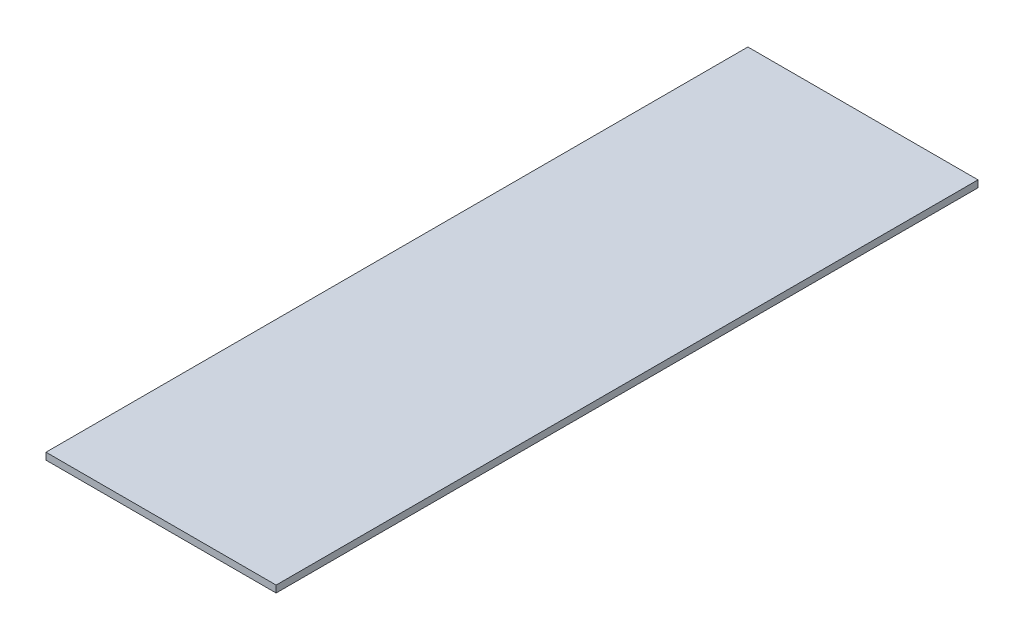
ISO-10303-21;
HEADER;
FILE_DESCRIPTION(('STEP AP214'),'2;1');
FILE_NAME('part.step','',(''),(''),'','','');
FILE_SCHEMA(('AUTOMOTIVE_DESIGN { 1 0 10303 214 1 1 1 1 }'));
ENDSEC;
DATA;
#1=APPLICATION_CONTEXT('core data for automotive mechanical design processes');
#2=APPLICATION_PROTOCOL_DEFINITION('international standard','automotive_design',2000,#1);
#3=PRODUCT_CONTEXT('',#1,'mechanical');
#4=PRODUCT('Part','Part','',(#3));
#5=PRODUCT_RELATED_PRODUCT_CATEGORY('part','',(#4));
#6=PRODUCT_DEFINITION_FORMATION('','',#4);
#7=PRODUCT_DEFINITION_CONTEXT('part definition',#1,'design');
#8=PRODUCT_DEFINITION('design','',#6,#7);
#9=PRODUCT_DEFINITION_SHAPE('','',#8);
#10=(LENGTH_UNIT() NAMED_UNIT(*) SI_UNIT(.MILLI.,.METRE.));
#11=(NAMED_UNIT(*) PLANE_ANGLE_UNIT() SI_UNIT($,.RADIAN.));
#12=(NAMED_UNIT(*) SI_UNIT($,.STERADIAN.) SOLID_ANGLE_UNIT());
#13=UNCERTAINTY_MEASURE_WITH_UNIT(LENGTH_MEASURE(1.E-05),#10,'distance_accuracy_value','');
#14=(GEOMETRIC_REPRESENTATION_CONTEXT(3) GLOBAL_UNCERTAINTY_ASSIGNED_CONTEXT((#13)) GLOBAL_UNIT_ASSIGNED_CONTEXT((#10,
#11,#12)) REPRESENTATION_CONTEXT('',''));
#15=CARTESIAN_POINT('',(0.,0.,0.));
#16=DIRECTION('',(0.,0.,1.));
#17=DIRECTION('',(1.,0.,0.));
#18=AXIS2_PLACEMENT_3D('',#15,#16,#17);
#19=CARTESIAN_POINT('',(50.,3.,-155.));
#20=DIRECTION('',(-1.,0.,0.));
#21=DIRECTION('',(0.,0.,1.));
#22=AXIS2_PLACEMENT_3D('',#19,#20,#21);
#23=PLANE('',#22);
#24=DIRECTION('',(0.,0.,-1.));
#25=VECTOR('',#24,1.);
#26=CARTESIAN_POINT('',(50.,0.,-155.));
#27=LINE('',#26,#25);
#28=CARTESIAN_POINT('',(50.,0.,152.5));
#29=VERTEX_POINT('',#28);
#30=CARTESIAN_POINT('',(50.,0.,-152.5));
#31=VERTEX_POINT('',#30);
#32=EDGE_CURVE('E101',#29,#31,#27,.T.);
#33=ORIENTED_EDGE('',*,*,#32,.T.);
#34=DIRECTION('',(0.,1.,0.));
#35=VECTOR('',#34,1.);
#36=CARTESIAN_POINT('',(50.,-7.,-152.5));
#37=LINE('',#36,#35);
#38=CARTESIAN_POINT('',(50.,3.,-152.5));
#39=VERTEX_POINT('',#38);
#40=EDGE_CURVE('E61',#31,#39,#37,.T.);
#41=ORIENTED_EDGE('',*,*,#40,.T.);
#42=DIRECTION('',(0.,0.,-1.));
#43=VECTOR('',#42,1.);
#44=CARTESIAN_POINT('',(50.,3.,-155.));
#45=LINE('',#44,#43);
#46=CARTESIAN_POINT('',(50.,3.,152.5));
#47=VERTEX_POINT('',#46);
#48=EDGE_CURVE('E92',#47,#39,#45,.T.);
#49=ORIENTED_EDGE('',*,*,#48,.F.);
#50=DIRECTION('',(0.,1.,0.));
#51=VECTOR('',#50,1.);
#52=CARTESIAN_POINT('',(50.,-7.,152.5));
#53=LINE('',#52,#51);
#54=EDGE_CURVE('E109',#29,#47,#53,.T.);
#55=ORIENTED_EDGE('',*,*,#54,.F.);
#56=EDGE_LOOP('',(#33,#41,#49,#55));
#57=FACE_BOUND('',#56,.T.);
#58=ADVANCED_FACE('F39',(#57),#23,.F.);
#59=CARTESIAN_POINT('',(-50.,3.,-155.));
#60=DIRECTION('',(1.,0.,0.));
#61=DIRECTION('',(0.,0.,-1.));
#62=AXIS2_PLACEMENT_3D('',#59,#60,#61);
#63=PLANE('',#62);
#64=DIRECTION('',(0.,0.,1.));
#65=VECTOR('',#64,1.);
#66=CARTESIAN_POINT('',(-50.,3.,-155.));
#67=LINE('',#66,#65);
#68=CARTESIAN_POINT('',(-50.,3.,-152.5));
#69=VERTEX_POINT('',#68);
#70=CARTESIAN_POINT('',(-50.,3.,152.5));
#71=VERTEX_POINT('',#70);
#72=EDGE_CURVE('E90',#69,#71,#67,.T.);
#73=ORIENTED_EDGE('',*,*,#72,.F.);
#74=DIRECTION('',(0.,1.,0.));
#75=VECTOR('',#74,1.);
#76=CARTESIAN_POINT('',(-50.,-7.,-152.5));
#77=LINE('',#76,#75);
#78=CARTESIAN_POINT('',(-50.,0.,-152.5));
#79=VERTEX_POINT('',#78);
#80=EDGE_CURVE('E76',#79,#69,#77,.T.);
#81=ORIENTED_EDGE('',*,*,#80,.F.);
#82=DIRECTION('',(0.,0.,1.));
#83=VECTOR('',#82,1.);
#84=CARTESIAN_POINT('',(-50.,0.,-155.));
#85=LINE('',#84,#83);
#86=CARTESIAN_POINT('',(-50.,0.,152.5));
#87=VERTEX_POINT('',#86);
#88=EDGE_CURVE('E97',#79,#87,#85,.T.);
#89=ORIENTED_EDGE('',*,*,#88,.T.);
#90=DIRECTION('',(0.,1.,0.));
#91=VECTOR('',#90,1.);
#92=CARTESIAN_POINT('',(-50.,-7.,152.5));
#93=LINE('',#92,#91);
#94=EDGE_CURVE('E53',#87,#71,#93,.T.);
#95=ORIENTED_EDGE('',*,*,#94,.T.);
#96=EDGE_LOOP('',(#73,#81,#89,#95));
#97=FACE_BOUND('',#96,.T.);
#98=ADVANCED_FACE('F95',(#97),#63,.F.);
#99=CARTESIAN_POINT('',(0.,3.,0.));
#100=DIRECTION('',(0.,1.,0.));
#101=DIRECTION('',(0.,0.,1.));
#102=AXIS2_PLACEMENT_3D('',#99,#100,#101);
#103=PLANE('',#102);
#104=DIRECTION('',(1.,0.,0.));
#105=VECTOR('',#104,1.);
#106=CARTESIAN_POINT('',(-50.,3.,-152.5));
#107=LINE('',#106,#105);
#108=EDGE_CURVE('E79',#69,#39,#107,.T.);
#109=ORIENTED_EDGE('',*,*,#108,.F.);
#110=ORIENTED_EDGE('',*,*,#72,.T.);
#111=DIRECTION('',(-1.,0.,0.));
#112=VECTOR('',#111,1.);
#113=CARTESIAN_POINT('',(-50.,3.,152.5));
#114=LINE('',#113,#112);
#115=EDGE_CURVE('E93',#47,#71,#114,.T.);
#116=ORIENTED_EDGE('',*,*,#115,.F.);
#117=ORIENTED_EDGE('',*,*,#48,.T.);
#118=EDGE_LOOP('',(#109,#110,#116,#117));
#119=FACE_BOUND('',#118,.T.);
#120=ADVANCED_FACE('F88',(#119),#103,.T.);
#121=CARTESIAN_POINT('',(0.,0.,0.));
#122=DIRECTION('',(0.,1.,0.));
#123=DIRECTION('',(0.,0.,1.));
#124=AXIS2_PLACEMENT_3D('',#121,#122,#123);
#125=PLANE('',#124);
#126=ORIENTED_EDGE('',*,*,#88,.F.);
#127=DIRECTION('',(1.,0.,0.));
#128=VECTOR('',#127,1.);
#129=CARTESIAN_POINT('',(0.,0.,-152.5));
#130=LINE('',#129,#128);
#131=EDGE_CURVE('E11',#79,#31,#130,.T.);
#132=ORIENTED_EDGE('',*,*,#131,.T.);
#133=ORIENTED_EDGE('',*,*,#32,.F.);
#134=DIRECTION('',(-1.,0.,0.));
#135=VECTOR('',#134,1.);
#136=CARTESIAN_POINT('',(0.,0.,152.5));
#137=LINE('',#136,#135);
#138=EDGE_CURVE('E46',#29,#87,#137,.T.);
#139=ORIENTED_EDGE('',*,*,#138,.T.);
#140=EDGE_LOOP('',(#126,#132,#133,#139));
#141=FACE_BOUND('',#140,.T.);
#142=ADVANCED_FACE('F105',(#141),#125,.F.);
#143=CARTESIAN_POINT('',(-50.,-7.,152.5));
#144=DIRECTION('',(0.,0.,-1.));
#145=DIRECTION('',(-1.,0.,0.));
#146=AXIS2_PLACEMENT_3D('',#143,#144,#145);
#147=PLANE('',#146);
#148=ORIENTED_EDGE('',*,*,#54,.T.);
#149=ORIENTED_EDGE('',*,*,#115,.T.);
#150=ORIENTED_EDGE('',*,*,#94,.F.);
#151=ORIENTED_EDGE('',*,*,#138,.F.);
#152=EDGE_LOOP('',(#148,#149,#150,#151));
#153=FACE_BOUND('',#152,.T.);
#154=ADVANCED_FACE('F108',(#153),#147,.F.);
#155=CARTESIAN_POINT('',(-50.,-7.,-152.5));
#156=DIRECTION('',(0.,0.,1.));
#157=DIRECTION('',(1.,0.,0.));
#158=AXIS2_PLACEMENT_3D('',#155,#156,#157);
#159=PLANE('',#158);
#160=ORIENTED_EDGE('',*,*,#80,.T.);
#161=ORIENTED_EDGE('',*,*,#108,.T.);
#162=ORIENTED_EDGE('',*,*,#40,.F.);
#163=ORIENTED_EDGE('',*,*,#131,.F.);
#164=EDGE_LOOP('',(#160,#161,#162,#163));
#165=FACE_BOUND('',#164,.T.);
#166=ADVANCED_FACE('F78',(#165),#159,.F.);
#167=CLOSED_SHELL('',(#58,#98,#120,#142,#154,#166));
#168=MANIFOLD_SOLID_BREP('B2',#167);
#169=ADVANCED_BREP_SHAPE_REPRESENTATION('',(#18,#168),#14);
#170=SHAPE_DEFINITION_REPRESENTATION(#9,#169);
ENDSEC;
END-ISO-10303-21;
